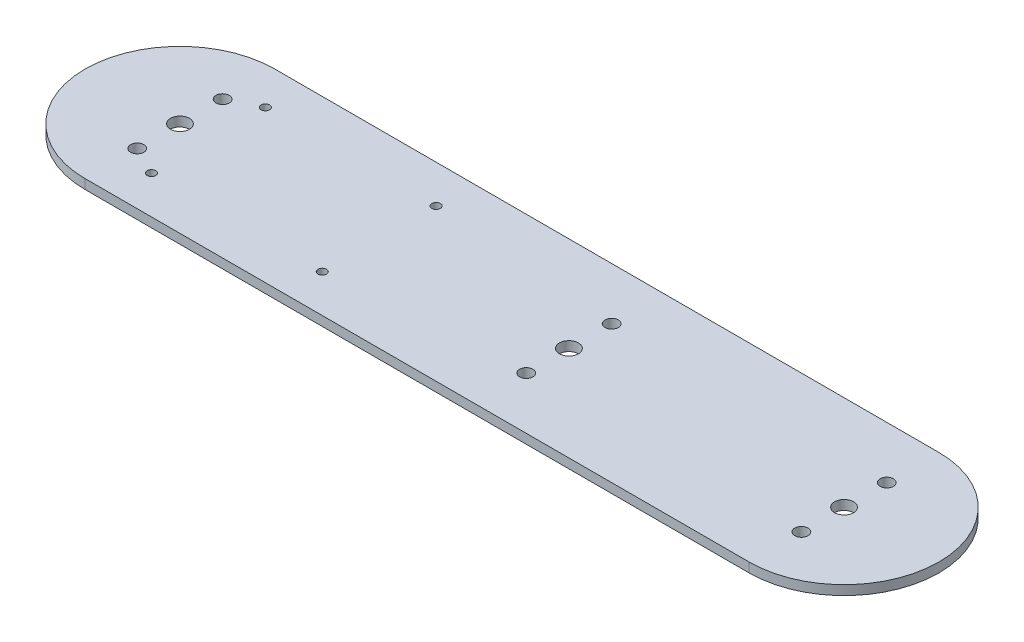
ISO-10303-21;
HEADER;
FILE_DESCRIPTION(('STEP AP214'),'2;1');
FILE_NAME('part.step','',(''),(''),'','','');
FILE_SCHEMA(('AUTOMOTIVE_DESIGN { 1 0 10303 214 1 1 1 1 }'));
ENDSEC;
DATA;
#1=APPLICATION_CONTEXT('core data for automotive mechanical design processes');
#2=APPLICATION_PROTOCOL_DEFINITION('international standard','automotive_design',2000,#1);
#3=PRODUCT_CONTEXT('',#1,'mechanical');
#4=PRODUCT('Part','Part','',(#3));
#5=PRODUCT_RELATED_PRODUCT_CATEGORY('part','',(#4));
#6=PRODUCT_DEFINITION_FORMATION('','',#4);
#7=PRODUCT_DEFINITION_CONTEXT('part definition',#1,'design');
#8=PRODUCT_DEFINITION('design','',#6,#7);
#9=PRODUCT_DEFINITION_SHAPE('','',#8);
#10=(LENGTH_UNIT() NAMED_UNIT(*) SI_UNIT(.MILLI.,.METRE.));
#11=(NAMED_UNIT(*) PLANE_ANGLE_UNIT() SI_UNIT($,.RADIAN.));
#12=(NAMED_UNIT(*) SI_UNIT($,.STERADIAN.) SOLID_ANGLE_UNIT());
#13=UNCERTAINTY_MEASURE_WITH_UNIT(LENGTH_MEASURE(1.E-05),#10,'distance_accuracy_value','');
#14=(GEOMETRIC_REPRESENTATION_CONTEXT(3) GLOBAL_UNCERTAINTY_ASSIGNED_CONTEXT((#13)) GLOBAL_UNIT_ASSIGNED_CONTEXT((#10,
#11,#12)) REPRESENTATION_CONTEXT('',''));
#15=CARTESIAN_POINT('',(0.,0.,0.));
#16=DIRECTION('',(0.,0.,1.));
#17=DIRECTION('',(1.,0.,0.));
#18=AXIS2_PLACEMENT_3D('',#15,#16,#17);
#19=CARTESIAN_POINT('',(0.,5.,0.));
#20=DIRECTION('',(0.,1.,0.));
#21=DIRECTION('',(0.,0.,1.));
#22=AXIS2_PLACEMENT_3D('',#19,#20,#21);
#23=PLANE('',#22);
#24=CARTESIAN_POINT('',(204.999999999994,5.,3.73099564220571E-11));
#25=DIRECTION('',(0.,1.,0.));
#26=DIRECTION('',(0.,0.,1.));
#27=AXIS2_PLACEMENT_3D('',#24,#25,#26);
#28=CIRCLE('',#27,5.00000000000002);
#29=CARTESIAN_POINT('',(204.999999999994,5.,5.00000000003733));
#30=VERTEX_POINT('',#29);
#31=EDGE_CURVE('E173',#30,#30,#28,.T.);
#32=ORIENTED_EDGE('',*,*,#31,.F.);
#33=EDGE_LOOP('',(#32));
#34=FACE_BOUND('',#33,.T.);
#35=CARTESIAN_POINT('',(14.9999999999998,5.,-30.));
#36=DIRECTION('',(0.,1.,0.));
#37=DIRECTION('',(0.,0.,1.));
#38=AXIS2_PLACEMENT_3D('',#35,#36,#37);
#39=CIRCLE('',#38,2.25);
#40=CARTESIAN_POINT('',(14.9999999999998,5.,-27.75));
#41=VERTEX_POINT('',#40);
#42=EDGE_CURVE('E162',#41,#41,#39,.T.);
#43=ORIENTED_EDGE('',*,*,#42,.F.);
#44=EDGE_LOOP('',(#43));
#45=FACE_BOUND('',#44,.T.);
#46=CARTESIAN_POINT('',(105.,5.,-30.));
#47=DIRECTION('',(0.,1.,0.));
#48=DIRECTION('',(0.,0.,1.));
#49=AXIS2_PLACEMENT_3D('',#46,#47,#48);
#50=CIRCLE('',#49,2.25000000000001);
#51=CARTESIAN_POINT('',(105.,5.,-27.75));
#52=VERTEX_POINT('',#51);
#53=EDGE_CURVE('E161',#52,#52,#50,.T.);
#54=ORIENTED_EDGE('',*,*,#53,.F.);
#55=EDGE_LOOP('',(#54));
#56=FACE_BOUND('',#55,.T.);
#57=CARTESIAN_POINT('',(105.,5.,30.));
#58=DIRECTION('',(0.,1.,0.));
#59=DIRECTION('',(0.,0.,1.));
#60=AXIS2_PLACEMENT_3D('',#57,#58,#59);
#61=CIRCLE('',#60,2.25000000000001);
#62=CARTESIAN_POINT('',(105.,5.,32.25));
#63=VERTEX_POINT('',#62);
#64=EDGE_CURVE('E155',#63,#63,#61,.T.);
#65=ORIENTED_EDGE('',*,*,#64,.F.);
#66=EDGE_LOOP('',(#65));
#67=FACE_BOUND('',#66,.T.);
#68=CARTESIAN_POINT('',(204.999999999994,5.,-22.5));
#69=DIRECTION('',(0.,1.,0.));
#70=DIRECTION('',(0.,0.,1.));
#71=AXIS2_PLACEMENT_3D('',#68,#69,#70);
#72=CIRCLE('',#71,3.50000000000002);
#73=CARTESIAN_POINT('',(204.999999999994,5.,-19.));
#74=VERTEX_POINT('',#73);
#75=EDGE_CURVE('E174',#74,#74,#72,.T.);
#76=ORIENTED_EDGE('',*,*,#75,.F.);
#77=EDGE_LOOP('',(#76));
#78=FACE_BOUND('',#77,.T.);
#79=CARTESIAN_POINT('',(204.999999999994,5.,22.5));
#80=DIRECTION('',(0.,1.,0.));
#81=DIRECTION('',(0.,0.,1.));
#82=AXIS2_PLACEMENT_3D('',#79,#80,#81);
#83=CIRCLE('',#82,3.50000000000002);
#84=CARTESIAN_POINT('',(204.999999999994,5.,26.));
#85=VERTEX_POINT('',#84);
#86=EDGE_CURVE('E185',#85,#85,#83,.T.);
#87=ORIENTED_EDGE('',*,*,#86,.F.);
#88=EDGE_LOOP('',(#87));
#89=FACE_BOUND('',#88,.T.);
#90=CARTESIAN_POINT('',(15.,5.,30.));
#91=DIRECTION('',(0.,1.,0.));
#92=DIRECTION('',(0.,0.,1.));
#93=AXIS2_PLACEMENT_3D('',#90,#91,#92);
#94=CIRCLE('',#93,2.25000000000001);
#95=CARTESIAN_POINT('',(15.,5.,32.25));
#96=VERTEX_POINT('',#95);
#97=EDGE_CURVE('E152',#96,#96,#94,.T.);
#98=ORIENTED_EDGE('',*,*,#97,.F.);
#99=EDGE_LOOP('',(#98));
#100=FACE_BOUND('',#99,.T.);
#101=CARTESIAN_POINT('',(350.,5.,22.5));
#102=DIRECTION('',(0.,1.,0.));
#103=DIRECTION('',(0.,0.,-1.));
#104=AXIS2_PLACEMENT_3D('',#101,#102,#103);
#105=CIRCLE('',#104,3.50000000000002);
#106=CARTESIAN_POINT('',(350.,5.,19.));
#107=VERTEX_POINT('',#106);
#108=EDGE_CURVE('E137',#107,#107,#105,.T.);
#109=ORIENTED_EDGE('',*,*,#108,.F.);
#110=EDGE_LOOP('',(#109));
#111=FACE_BOUND('',#110,.T.);
#112=CARTESIAN_POINT('',(0.,5.,-22.5));
#113=DIRECTION('',(0.,1.,0.));
#114=DIRECTION('',(0.,0.,1.));
#115=AXIS2_PLACEMENT_3D('',#112,#113,#114);
#116=CIRCLE('',#115,3.5);
#117=CARTESIAN_POINT('',(0.,5.,-19.));
#118=VERTEX_POINT('',#117);
#119=EDGE_CURVE('E125',#118,#118,#116,.T.);
#120=ORIENTED_EDGE('',*,*,#119,.F.);
#121=EDGE_LOOP('',(#120));
#122=FACE_BOUND('',#121,.T.);
#123=CARTESIAN_POINT('',(0.,5.,0.));
#124=DIRECTION('',(0.,1.,0.));
#125=DIRECTION('',(0.,0.,1.));
#126=AXIS2_PLACEMENT_3D('',#123,#124,#125);
#127=CIRCLE('',#126,5.);
#128=CARTESIAN_POINT('',(0.,5.,5.));
#129=VERTEX_POINT('',#128);
#130=EDGE_CURVE('E104',#129,#129,#127,.T.);
#131=ORIENTED_EDGE('',*,*,#130,.F.);
#132=EDGE_LOOP('',(#131));
#133=FACE_BOUND('',#132,.T.);
#134=CARTESIAN_POINT('',(0.,5.,0.));
#135=DIRECTION('',(0.,1.,0.));
#136=DIRECTION('',(0.,0.,1.));
#137=AXIS2_PLACEMENT_3D('',#134,#135,#136);
#138=CIRCLE('',#137,50.);
#139=CARTESIAN_POINT('',(0.,5.,-50.));
#140=VERTEX_POINT('',#139);
#141=CARTESIAN_POINT('',(0.,5.,50.));
#142=VERTEX_POINT('',#141);
#143=EDGE_CURVE('E89',#140,#142,#138,.T.);
#144=ORIENTED_EDGE('',*,*,#143,.T.);
#145=DIRECTION('',(1.,0.,0.));
#146=VECTOR('',#145,1.);
#147=CARTESIAN_POINT('',(0.,5.,50.));
#148=LINE('',#147,#146);
#149=CARTESIAN_POINT('',(350.,5.,50.));
#150=VERTEX_POINT('',#149);
#151=EDGE_CURVE('E84',#142,#150,#148,.T.);
#152=ORIENTED_EDGE('',*,*,#151,.T.);
#153=CARTESIAN_POINT('',(350.,5.,0.));
#154=DIRECTION('',(0.,1.,0.));
#155=DIRECTION('',(0.,0.,1.));
#156=AXIS2_PLACEMENT_3D('',#153,#154,#155);
#157=CIRCLE('',#156,50.);
#158=CARTESIAN_POINT('',(350.,5.,-50.));
#159=VERTEX_POINT('',#158);
#160=EDGE_CURVE('E87',#150,#159,#157,.T.);
#161=ORIENTED_EDGE('',*,*,#160,.T.);
#162=DIRECTION('',(-1.,0.,0.));
#163=VECTOR('',#162,1.);
#164=CARTESIAN_POINT('',(0.,5.,-50.));
#165=LINE('',#164,#163);
#166=EDGE_CURVE('E54',#159,#140,#165,.T.);
#167=ORIENTED_EDGE('',*,*,#166,.T.);
#168=EDGE_LOOP('',(#144,#152,#161,#167));
#169=FACE_BOUND('',#168,.T.);
#170=CARTESIAN_POINT('',(350.,5.,0.));
#171=DIRECTION('',(0.,1.,0.));
#172=DIRECTION('',(0.,0.,1.));
#173=AXIS2_PLACEMENT_3D('',#170,#171,#172);
#174=CIRCLE('',#173,4.99999999999999);
#175=CARTESIAN_POINT('',(350.,5.,4.99999999999999));
#176=VERTEX_POINT('',#175);
#177=EDGE_CURVE('E119',#176,#176,#174,.T.);
#178=ORIENTED_EDGE('',*,*,#177,.F.);
#179=EDGE_LOOP('',(#178));
#180=FACE_BOUND('',#179,.T.);
#181=CARTESIAN_POINT('',(350.,5.,-22.5));
#182=DIRECTION('',(0.,1.,0.));
#183=DIRECTION('',(0.,0.,1.));
#184=AXIS2_PLACEMENT_3D('',#181,#182,#183);
#185=CIRCLE('',#184,3.50000000000002);
#186=CARTESIAN_POINT('',(350.,5.,-19.));
#187=VERTEX_POINT('',#186);
#188=EDGE_CURVE('E131',#187,#187,#185,.T.);
#189=ORIENTED_EDGE('',*,*,#188,.F.);
#190=EDGE_LOOP('',(#189));
#191=FACE_BOUND('',#190,.T.);
#192=CARTESIAN_POINT('',(0.,5.,22.5));
#193=DIRECTION('',(0.,1.,0.));
#194=DIRECTION('',(0.,0.,-1.));
#195=AXIS2_PLACEMENT_3D('',#192,#193,#194);
#196=CIRCLE('',#195,3.5);
#197=CARTESIAN_POINT('',(0.,5.,19.));
#198=VERTEX_POINT('',#197);
#199=EDGE_CURVE('E143',#198,#198,#196,.T.);
#200=ORIENTED_EDGE('',*,*,#199,.F.);
#201=EDGE_LOOP('',(#200));
#202=FACE_BOUND('',#201,.T.);
#203=ADVANCED_FACE('F37',(#34,#45,#56,#67,#78,#89,#100,#111,#122,#133,#169,#180,#191,#202),#23,.T.);
#204=CARTESIAN_POINT('',(0.,0.,0.));
#205=DIRECTION('',(0.,1.,0.));
#206=DIRECTION('',(0.,0.,1.));
#207=AXIS2_PLACEMENT_3D('',#204,#205,#206);
#208=PLANE('',#207);
#209=CARTESIAN_POINT('',(204.999999999994,0.,3.73099564220571E-11));
#210=DIRECTION('',(0.,1.,0.));
#211=DIRECTION('',(0.,0.,1.));
#212=AXIS2_PLACEMENT_3D('',#209,#210,#211);
#213=CIRCLE('',#212,5.00000000000002);
#214=CARTESIAN_POINT('',(204.999999999994,0.,5.00000000003733));
#215=VERTEX_POINT('',#214);
#216=EDGE_CURVE('E170',#215,#215,#213,.T.);
#217=ORIENTED_EDGE('',*,*,#216,.T.);
#218=EDGE_LOOP('',(#217));
#219=FACE_BOUND('',#218,.T.);
#220=CARTESIAN_POINT('',(14.9999999999998,0.,-30.));
#221=DIRECTION('',(0.,1.,0.));
#222=DIRECTION('',(0.,0.,1.));
#223=AXIS2_PLACEMENT_3D('',#220,#221,#222);
#224=CIRCLE('',#223,2.25);
#225=CARTESIAN_POINT('',(14.9999999999998,0.,-27.75));
#226=VERTEX_POINT('',#225);
#227=EDGE_CURVE('E177',#226,#226,#224,.T.);
#228=ORIENTED_EDGE('',*,*,#227,.T.);
#229=EDGE_LOOP('',(#228));
#230=FACE_BOUND('',#229,.T.);
#231=CARTESIAN_POINT('',(105.,0.,-30.));
#232=DIRECTION('',(0.,1.,0.));
#233=DIRECTION('',(0.,0.,1.));
#234=AXIS2_PLACEMENT_3D('',#231,#232,#233);
#235=CIRCLE('',#234,2.25000000000001);
#236=CARTESIAN_POINT('',(105.,0.,-27.75));
#237=VERTEX_POINT('',#236);
#238=EDGE_CURVE('E158',#237,#237,#235,.T.);
#239=ORIENTED_EDGE('',*,*,#238,.T.);
#240=EDGE_LOOP('',(#239));
#241=FACE_BOUND('',#240,.T.);
#242=CARTESIAN_POINT('',(105.,0.,30.));
#243=DIRECTION('',(0.,1.,0.));
#244=DIRECTION('',(0.,0.,1.));
#245=AXIS2_PLACEMENT_3D('',#242,#243,#244);
#246=CIRCLE('',#245,2.25000000000001);
#247=CARTESIAN_POINT('',(105.,0.,32.25));
#248=VERTEX_POINT('',#247);
#249=EDGE_CURVE('E165',#248,#248,#246,.T.);
#250=ORIENTED_EDGE('',*,*,#249,.T.);
#251=EDGE_LOOP('',(#250));
#252=FACE_BOUND('',#251,.T.);
#253=CARTESIAN_POINT('',(204.999999999994,0.,-22.5));
#254=DIRECTION('',(0.,1.,0.));
#255=DIRECTION('',(0.,0.,1.));
#256=AXIS2_PLACEMENT_3D('',#253,#254,#255);
#257=CIRCLE('',#256,3.50000000000002);
#258=CARTESIAN_POINT('',(204.999999999994,0.,-19.));
#259=VERTEX_POINT('',#258);
#260=EDGE_CURVE('E188',#259,#259,#257,.T.);
#261=ORIENTED_EDGE('',*,*,#260,.T.);
#262=EDGE_LOOP('',(#261));
#263=FACE_BOUND('',#262,.T.);
#264=CARTESIAN_POINT('',(204.999999999994,0.,22.5));
#265=DIRECTION('',(0.,1.,0.));
#266=DIRECTION('',(0.,0.,1.));
#267=AXIS2_PLACEMENT_3D('',#264,#265,#266);
#268=CIRCLE('',#267,3.50000000000002);
#269=CARTESIAN_POINT('',(204.999999999994,0.,26.));
#270=VERTEX_POINT('',#269);
#271=EDGE_CURVE('E182',#270,#270,#268,.T.);
#272=ORIENTED_EDGE('',*,*,#271,.T.);
#273=EDGE_LOOP('',(#272));
#274=FACE_BOUND('',#273,.T.);
#275=CARTESIAN_POINT('',(15.,0.,30.));
#276=DIRECTION('',(0.,1.,0.));
#277=DIRECTION('',(0.,0.,1.));
#278=AXIS2_PLACEMENT_3D('',#275,#276,#277);
#279=CIRCLE('',#278,2.25000000000001);
#280=CARTESIAN_POINT('',(15.,0.,32.25));
#281=VERTEX_POINT('',#280);
#282=EDGE_CURVE('E149',#281,#281,#279,.T.);
#283=ORIENTED_EDGE('',*,*,#282,.T.);
#284=EDGE_LOOP('',(#283));
#285=FACE_BOUND('',#284,.T.);
#286=CARTESIAN_POINT('',(0.,0.,0.));
#287=DIRECTION('',(0.,1.,0.));
#288=DIRECTION('',(0.,0.,1.));
#289=AXIS2_PLACEMENT_3D('',#286,#287,#288);
#290=CIRCLE('',#289,50.);
#291=CARTESIAN_POINT('',(0.,0.,-50.));
#292=VERTEX_POINT('',#291);
#293=CARTESIAN_POINT('',(0.,0.,50.));
#294=VERTEX_POINT('',#293);
#295=EDGE_CURVE('E101',#292,#294,#290,.T.);
#296=ORIENTED_EDGE('',*,*,#295,.F.);
#297=DIRECTION('',(-1.,0.,0.));
#298=VECTOR('',#297,1.);
#299=CARTESIAN_POINT('',(0.,0.,-50.));
#300=LINE('',#299,#298);
#301=CARTESIAN_POINT('',(350.,0.,-50.));
#302=VERTEX_POINT('',#301);
#303=EDGE_CURVE('E77',#302,#292,#300,.T.);
#304=ORIENTED_EDGE('',*,*,#303,.F.);
#305=CARTESIAN_POINT('',(350.,0.,0.));
#306=DIRECTION('',(0.,1.,0.));
#307=DIRECTION('',(0.,0.,1.));
#308=AXIS2_PLACEMENT_3D('',#305,#306,#307);
#309=CIRCLE('',#308,50.);
#310=CARTESIAN_POINT('',(350.,0.,50.));
#311=VERTEX_POINT('',#310);
#312=EDGE_CURVE('E71',#311,#302,#309,.T.);
#313=ORIENTED_EDGE('',*,*,#312,.F.);
#314=DIRECTION('',(1.,0.,0.));
#315=VECTOR('',#314,1.);
#316=CARTESIAN_POINT('',(0.,0.,50.));
#317=LINE('',#316,#315);
#318=EDGE_CURVE('E93',#294,#311,#317,.T.);
#319=ORIENTED_EDGE('',*,*,#318,.F.);
#320=EDGE_LOOP('',(#296,#304,#313,#319));
#321=FACE_BOUND('',#320,.T.);
#322=CARTESIAN_POINT('',(0.,0.,0.));
#323=DIRECTION('',(0.,1.,0.));
#324=DIRECTION('',(0.,0.,1.));
#325=AXIS2_PLACEMENT_3D('',#322,#323,#324);
#326=CIRCLE('',#325,5.);
#327=CARTESIAN_POINT('',(0.,0.,5.));
#328=VERTEX_POINT('',#327);
#329=EDGE_CURVE('E116',#328,#328,#326,.T.);
#330=ORIENTED_EDGE('',*,*,#329,.T.);
#331=EDGE_LOOP('',(#330));
#332=FACE_BOUND('',#331,.T.);
#333=CARTESIAN_POINT('',(350.,0.,0.));
#334=DIRECTION('',(0.,1.,0.));
#335=DIRECTION('',(0.,0.,1.));
#336=AXIS2_PLACEMENT_3D('',#333,#334,#335);
#337=CIRCLE('',#336,4.99999999999999);
#338=CARTESIAN_POINT('',(350.,0.,4.99999999999999));
#339=VERTEX_POINT('',#338);
#340=EDGE_CURVE('E122',#339,#339,#337,.T.);
#341=ORIENTED_EDGE('',*,*,#340,.T.);
#342=EDGE_LOOP('',(#341));
#343=FACE_BOUND('',#342,.T.);
#344=CARTESIAN_POINT('',(0.,0.,-22.5));
#345=DIRECTION('',(0.,1.,0.));
#346=DIRECTION('',(0.,0.,1.));
#347=AXIS2_PLACEMENT_3D('',#344,#345,#346);
#348=CIRCLE('',#347,3.5);
#349=CARTESIAN_POINT('',(0.,0.,-19.));
#350=VERTEX_POINT('',#349);
#351=EDGE_CURVE('E128',#350,#350,#348,.T.);
#352=ORIENTED_EDGE('',*,*,#351,.T.);
#353=EDGE_LOOP('',(#352));
#354=FACE_BOUND('',#353,.T.);
#355=CARTESIAN_POINT('',(350.,0.,-22.5));
#356=DIRECTION('',(0.,1.,0.));
#357=DIRECTION('',(0.,0.,1.));
#358=AXIS2_PLACEMENT_3D('',#355,#356,#357);
#359=CIRCLE('',#358,3.50000000000002);
#360=CARTESIAN_POINT('',(350.,0.,-19.));
#361=VERTEX_POINT('',#360);
#362=EDGE_CURVE('E134',#361,#361,#359,.T.);
#363=ORIENTED_EDGE('',*,*,#362,.T.);
#364=EDGE_LOOP('',(#363));
#365=FACE_BOUND('',#364,.T.);
#366=CARTESIAN_POINT('',(350.,0.,22.5));
#367=DIRECTION('',(0.,1.,0.));
#368=DIRECTION('',(0.,0.,-1.));
#369=AXIS2_PLACEMENT_3D('',#366,#367,#368);
#370=CIRCLE('',#369,3.50000000000002);
#371=CARTESIAN_POINT('',(350.,0.,19.));
#372=VERTEX_POINT('',#371);
#373=EDGE_CURVE('E140',#372,#372,#370,.T.);
#374=ORIENTED_EDGE('',*,*,#373,.T.);
#375=EDGE_LOOP('',(#374));
#376=FACE_BOUND('',#375,.T.);
#377=CARTESIAN_POINT('',(0.,0.,22.5));
#378=DIRECTION('',(0.,1.,0.));
#379=DIRECTION('',(0.,0.,-1.));
#380=AXIS2_PLACEMENT_3D('',#377,#378,#379);
#381=CIRCLE('',#380,3.5);
#382=CARTESIAN_POINT('',(0.,0.,19.));
#383=VERTEX_POINT('',#382);
#384=EDGE_CURVE('E146',#383,#383,#381,.T.);
#385=ORIENTED_EDGE('',*,*,#384,.T.);
#386=EDGE_LOOP('',(#385));
#387=FACE_BOUND('',#386,.T.);
#388=ADVANCED_FACE('F112',(#219,#230,#241,#252,#263,#274,#285,#321,#332,#343,#354,#365,#376,
#387),#208,.F.);
#389=CARTESIAN_POINT('',(0.,5.,0.));
#390=DIRECTION('',(0.,-1.,0.));
#391=DIRECTION('',(0.,0.,-1.));
#392=AXIS2_PLACEMENT_3D('',#389,#390,#391);
#393=CYLINDRICAL_SURFACE('',#392,50.);
#394=ORIENTED_EDGE('',*,*,#295,.T.);
#395=DIRECTION('',(0.,-1.,0.));
#396=VECTOR('',#395,1.);
#397=CARTESIAN_POINT('',(0.,5.,50.));
#398=LINE('',#397,#396);
#399=EDGE_CURVE('E11',#142,#294,#398,.T.);
#400=ORIENTED_EDGE('',*,*,#399,.F.);
#401=ORIENTED_EDGE('',*,*,#143,.F.);
#402=DIRECTION('',(0.,-1.,0.));
#403=VECTOR('',#402,1.);
#404=CARTESIAN_POINT('',(0.,5.,-50.));
#405=LINE('',#404,#403);
#406=EDGE_CURVE('E97',#140,#292,#405,.T.);
#407=ORIENTED_EDGE('',*,*,#406,.T.);
#408=EDGE_LOOP('',(#394,#400,#401,#407));
#409=FACE_BOUND('',#408,.T.);
#410=ADVANCED_FACE('F39',(#409),#393,.T.);
#411=CARTESIAN_POINT('',(0.,5.,50.));
#412=DIRECTION('',(0.,0.,-1.));
#413=DIRECTION('',(-1.,0.,0.));
#414=AXIS2_PLACEMENT_3D('',#411,#412,#413);
#415=PLANE('',#414);
#416=ORIENTED_EDGE('',*,*,#318,.T.);
#417=DIRECTION('',(0.,-1.,0.));
#418=VECTOR('',#417,1.);
#419=CARTESIAN_POINT('',(350.,5.,50.));
#420=LINE('',#419,#418);
#421=EDGE_CURVE('E46',#150,#311,#420,.T.);
#422=ORIENTED_EDGE('',*,*,#421,.F.);
#423=ORIENTED_EDGE('',*,*,#151,.F.);
#424=ORIENTED_EDGE('',*,*,#399,.T.);
#425=EDGE_LOOP('',(#416,#422,#423,#424));
#426=FACE_BOUND('',#425,.T.);
#427=ADVANCED_FACE('F92',(#426),#415,.F.);
#428=CARTESIAN_POINT('',(350.,5.,0.));
#429=DIRECTION('',(0.,-1.,0.));
#430=DIRECTION('',(0.,0.,-1.));
#431=AXIS2_PLACEMENT_3D('',#428,#429,#430);
#432=CYLINDRICAL_SURFACE('',#431,50.);
#433=ORIENTED_EDGE('',*,*,#312,.T.);
#434=DIRECTION('',(0.,-1.,0.));
#435=VECTOR('',#434,1.);
#436=CARTESIAN_POINT('',(350.,5.,-50.));
#437=LINE('',#436,#435);
#438=EDGE_CURVE('E94',#159,#302,#437,.T.);
#439=ORIENTED_EDGE('',*,*,#438,.F.);
#440=ORIENTED_EDGE('',*,*,#160,.F.);
#441=ORIENTED_EDGE('',*,*,#421,.T.);
#442=EDGE_LOOP('',(#433,#439,#440,#441));
#443=FACE_BOUND('',#442,.T.);
#444=ADVANCED_FACE('F95',(#443),#432,.T.);
#445=CARTESIAN_POINT('',(0.,5.,-50.));
#446=DIRECTION('',(0.,0.,1.));
#447=DIRECTION('',(1.,0.,0.));
#448=AXIS2_PLACEMENT_3D('',#445,#446,#447);
#449=PLANE('',#448);
#450=ORIENTED_EDGE('',*,*,#303,.T.);
#451=ORIENTED_EDGE('',*,*,#406,.F.);
#452=ORIENTED_EDGE('',*,*,#166,.F.);
#453=ORIENTED_EDGE('',*,*,#438,.T.);
#454=EDGE_LOOP('',(#450,#451,#452,#453));
#455=FACE_BOUND('',#454,.T.);
#456=ADVANCED_FACE('F109',(#455),#449,.F.);
#457=CARTESIAN_POINT('',(0.,5.,0.));
#458=DIRECTION('',(0.,-1.,0.));
#459=DIRECTION('',(0.,0.,-1.));
#460=AXIS2_PLACEMENT_3D('',#457,#458,#459);
#461=CYLINDRICAL_SURFACE('',#460,5.);
#462=ORIENTED_EDGE('',*,*,#130,.T.);
#463=EDGE_LOOP('',(#462));
#464=FACE_BOUND('',#463,.T.);
#465=ORIENTED_EDGE('',*,*,#329,.F.);
#466=EDGE_LOOP('',(#465));
#467=FACE_BOUND('',#466,.T.);
#468=ADVANCED_FACE('F210',(#464,#467),#461,.F.);
#469=CARTESIAN_POINT('',(350.,5.,0.));
#470=DIRECTION('',(0.,-1.,0.));
#471=DIRECTION('',(0.,0.,-1.));
#472=AXIS2_PLACEMENT_3D('',#469,#470,#471);
#473=CYLINDRICAL_SURFACE('',#472,4.99999999999999);
#474=ORIENTED_EDGE('',*,*,#177,.T.);
#475=EDGE_LOOP('',(#474));
#476=FACE_BOUND('',#475,.T.);
#477=ORIENTED_EDGE('',*,*,#340,.F.);
#478=EDGE_LOOP('',(#477));
#479=FACE_BOUND('',#478,.T.);
#480=ADVANCED_FACE('F213',(#476,#479),#473,.F.);
#481=CARTESIAN_POINT('',(0.,5.,-22.5));
#482=DIRECTION('',(0.,-1.,0.));
#483=DIRECTION('',(0.,0.,-1.));
#484=AXIS2_PLACEMENT_3D('',#481,#482,#483);
#485=CYLINDRICAL_SURFACE('',#484,3.5);
#486=ORIENTED_EDGE('',*,*,#119,.T.);
#487=EDGE_LOOP('',(#486));
#488=FACE_BOUND('',#487,.T.);
#489=ORIENTED_EDGE('',*,*,#351,.F.);
#490=EDGE_LOOP('',(#489));
#491=FACE_BOUND('',#490,.T.);
#492=ADVANCED_FACE('F250',(#488,#491),#485,.F.);
#493=CARTESIAN_POINT('',(350.,5.,-22.5));
#494=DIRECTION('',(0.,-1.,0.));
#495=DIRECTION('',(0.,0.,-1.));
#496=AXIS2_PLACEMENT_3D('',#493,#494,#495);
#497=CYLINDRICAL_SURFACE('',#496,3.50000000000002);
#498=ORIENTED_EDGE('',*,*,#188,.T.);
#499=EDGE_LOOP('',(#498));
#500=FACE_BOUND('',#499,.T.);
#501=ORIENTED_EDGE('',*,*,#362,.F.);
#502=EDGE_LOOP('',(#501));
#503=FACE_BOUND('',#502,.T.);
#504=ADVANCED_FACE('F243',(#500,#503),#497,.F.);
#505=CARTESIAN_POINT('',(350.,5.,22.5));
#506=DIRECTION('',(0.,-1.,0.));
#507=DIRECTION('',(0.,0.,-1.));
#508=AXIS2_PLACEMENT_3D('',#505,#506,#507);
#509=CYLINDRICAL_SURFACE('',#508,3.50000000000002);
#510=ORIENTED_EDGE('',*,*,#108,.T.);
#511=EDGE_LOOP('',(#510));
#512=FACE_BOUND('',#511,.T.);
#513=ORIENTED_EDGE('',*,*,#373,.F.);
#514=EDGE_LOOP('',(#513));
#515=FACE_BOUND('',#514,.T.);
#516=ADVANCED_FACE('F233',(#512,#515),#509,.F.);
#517=CARTESIAN_POINT('',(0.,5.,22.5));
#518=DIRECTION('',(0.,-1.,0.));
#519=DIRECTION('',(0.,0.,-1.));
#520=AXIS2_PLACEMENT_3D('',#517,#518,#519);
#521=CYLINDRICAL_SURFACE('',#520,3.5);
#522=ORIENTED_EDGE('',*,*,#199,.T.);
#523=EDGE_LOOP('',(#522));
#524=FACE_BOUND('',#523,.T.);
#525=ORIENTED_EDGE('',*,*,#384,.F.);
#526=EDGE_LOOP('',(#525));
#527=FACE_BOUND('',#526,.T.);
#528=ADVANCED_FACE('F230',(#524,#527),#521,.F.);
#529=CARTESIAN_POINT('',(15.,0.,30.));
#530=DIRECTION('',(0.,1.,0.));
#531=DIRECTION('',(0.,0.,1.));
#532=AXIS2_PLACEMENT_3D('',#529,#530,#531);
#533=CYLINDRICAL_SURFACE('',#532,2.25000000000001);
#534=ORIENTED_EDGE('',*,*,#282,.F.);
#535=EDGE_LOOP('',(#534));
#536=FACE_BOUND('',#535,.T.);
#537=ORIENTED_EDGE('',*,*,#97,.T.);
#538=EDGE_LOOP('',(#537));
#539=FACE_BOUND('',#538,.T.);
#540=ADVANCED_FACE('F232',(#536,#539),#533,.F.);
#541=CARTESIAN_POINT('',(204.999999999994,0.,22.5));
#542=DIRECTION('',(0.,1.,0.));
#543=DIRECTION('',(0.,0.,1.));
#544=AXIS2_PLACEMENT_3D('',#541,#542,#543);
#545=CYLINDRICAL_SURFACE('',#544,3.50000000000002);
#546=ORIENTED_EDGE('',*,*,#271,.F.);
#547=EDGE_LOOP('',(#546));
#548=FACE_BOUND('',#547,.T.);
#549=ORIENTED_EDGE('',*,*,#86,.T.);
#550=EDGE_LOOP('',(#549));
#551=FACE_BOUND('',#550,.T.);
#552=ADVANCED_FACE('F240',(#548,#551),#545,.F.);
#553=CARTESIAN_POINT('',(204.999999999994,0.,-22.5));
#554=DIRECTION('',(0.,1.,0.));
#555=DIRECTION('',(0.,0.,1.));
#556=AXIS2_PLACEMENT_3D('',#553,#554,#555);
#557=CYLINDRICAL_SURFACE('',#556,3.50000000000002);
#558=ORIENTED_EDGE('',*,*,#260,.F.);
#559=EDGE_LOOP('',(#558));
#560=FACE_BOUND('',#559,.T.);
#561=ORIENTED_EDGE('',*,*,#75,.T.);
#562=EDGE_LOOP('',(#561));
#563=FACE_BOUND('',#562,.T.);
#564=ADVANCED_FACE('F194',(#560,#563),#557,.F.);
#565=CARTESIAN_POINT('',(105.,0.,30.));
#566=DIRECTION('',(0.,1.,0.));
#567=DIRECTION('',(0.,0.,1.));
#568=AXIS2_PLACEMENT_3D('',#565,#566,#567);
#569=CYLINDRICAL_SURFACE('',#568,2.25000000000001);
#570=ORIENTED_EDGE('',*,*,#249,.F.);
#571=EDGE_LOOP('',(#570));
#572=FACE_BOUND('',#571,.T.);
#573=ORIENTED_EDGE('',*,*,#64,.T.);
#574=EDGE_LOOP('',(#573));
#575=FACE_BOUND('',#574,.T.);
#576=ADVANCED_FACE('F377',(#572,#575),#569,.F.);
#577=CARTESIAN_POINT('',(105.,0.,-30.));
#578=DIRECTION('',(0.,1.,0.));
#579=DIRECTION('',(0.,0.,1.));
#580=AXIS2_PLACEMENT_3D('',#577,#578,#579);
#581=CYLINDRICAL_SURFACE('',#580,2.25000000000001);
#582=ORIENTED_EDGE('',*,*,#238,.F.);
#583=EDGE_LOOP('',(#582));
#584=FACE_BOUND('',#583,.T.);
#585=ORIENTED_EDGE('',*,*,#53,.T.);
#586=EDGE_LOOP('',(#585));
#587=FACE_BOUND('',#586,.T.);
#588=ADVANCED_FACE('F387',(#584,#587),#581,.F.);
#589=CARTESIAN_POINT('',(14.9999999999998,0.,-30.));
#590=DIRECTION('',(0.,1.,0.));
#591=DIRECTION('',(0.,0.,1.));
#592=AXIS2_PLACEMENT_3D('',#589,#590,#591);
#593=CYLINDRICAL_SURFACE('',#592,2.25);
#594=ORIENTED_EDGE('',*,*,#227,.F.);
#595=EDGE_LOOP('',(#594));
#596=FACE_BOUND('',#595,.T.);
#597=ORIENTED_EDGE('',*,*,#42,.T.);
#598=EDGE_LOOP('',(#597));
#599=FACE_BOUND('',#598,.T.);
#600=ADVANCED_FACE('F397',(#596,#599),#593,.F.);
#601=CARTESIAN_POINT('',(204.999999999994,0.,3.73099564220571E-11));
#602=DIRECTION('',(0.,1.,0.));
#603=DIRECTION('',(0.,0.,1.));
#604=AXIS2_PLACEMENT_3D('',#601,#602,#603);
#605=CYLINDRICAL_SURFACE('',#604,5.00000000000002);
#606=ORIENTED_EDGE('',*,*,#216,.F.);
#607=EDGE_LOOP('',(#606));
#608=FACE_BOUND('',#607,.T.);
#609=ORIENTED_EDGE('',*,*,#31,.T.);
#610=EDGE_LOOP('',(#609));
#611=FACE_BOUND('',#610,.T.);
#612=ADVANCED_FACE('F406',(#608,#611),#605,.F.);
#613=CLOSED_SHELL('',(#203,#388,#410,#427,#444,#456,#468,#480,#492,#504,#516,#528,#540,#552,
#564,#576,#588,#600,#612));
#614=MANIFOLD_SOLID_BREP('B2',#613);
#615=ADVANCED_BREP_SHAPE_REPRESENTATION('',(#18,#614),#14);
#616=SHAPE_DEFINITION_REPRESENTATION(#9,#615);
ENDSEC;
END-ISO-10303-21;
